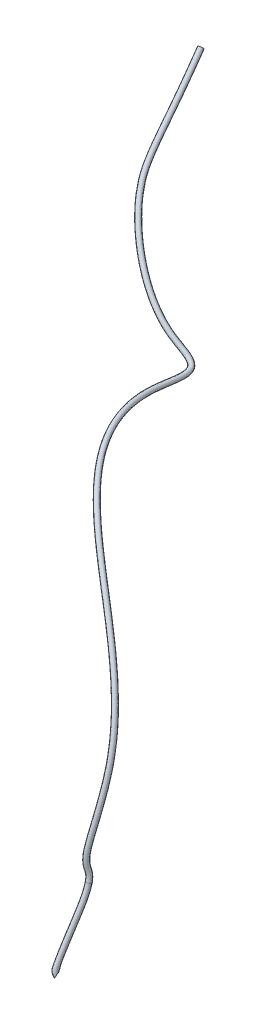
ISO-10303-21;
HEADER;
FILE_DESCRIPTION(('STEP AP214'),'2;1');
FILE_NAME('part.step','',(''),(''),'','','');
FILE_SCHEMA(('AUTOMOTIVE_DESIGN { 1 0 10303 214 1 1 1 1 }'));
ENDSEC;
DATA;
#1=APPLICATION_CONTEXT('core data for automotive mechanical design processes');
#2=APPLICATION_PROTOCOL_DEFINITION('international standard','automotive_design',2000,#1);
#3=PRODUCT_CONTEXT('',#1,'mechanical');
#4=PRODUCT('Part','Part','',(#3));
#5=PRODUCT_RELATED_PRODUCT_CATEGORY('part','',(#4));
#6=PRODUCT_DEFINITION_FORMATION('','',#4);
#7=PRODUCT_DEFINITION_CONTEXT('part definition',#1,'design');
#8=PRODUCT_DEFINITION('design','',#6,#7);
#9=PRODUCT_DEFINITION_SHAPE('','',#8);
#10=(LENGTH_UNIT() NAMED_UNIT(*) SI_UNIT(.MILLI.,.METRE.));
#11=(NAMED_UNIT(*) PLANE_ANGLE_UNIT() SI_UNIT($,.RADIAN.));
#12=(NAMED_UNIT(*) SI_UNIT($,.STERADIAN.) SOLID_ANGLE_UNIT());
#13=UNCERTAINTY_MEASURE_WITH_UNIT(LENGTH_MEASURE(1.E-05),#10,'distance_accuracy_value','');
#14=(GEOMETRIC_REPRESENTATION_CONTEXT(3) GLOBAL_UNCERTAINTY_ASSIGNED_CONTEXT((#13)) GLOBAL_UNIT_ASSIGNED_CONTEXT((#10,
#11,#12)) REPRESENTATION_CONTEXT('',''));
#15=CARTESIAN_POINT('',(0.,0.,0.));
#16=DIRECTION('',(0.,0.,1.));
#17=DIRECTION('',(1.,0.,0.));
#18=AXIS2_PLACEMENT_3D('',#15,#16,#17);
#19=CARTESIAN_POINT('',(-56.1618579724159,36.8513685017414,0.722907331744665));
#20=DIRECTION('',(0.188033840117382,-0.628702409049852,0.754570444574676));
#21=DIRECTION('',(0.,-0.768274502462435,-0.640120526827642));
#22=AXIS2_PLACEMENT_3D('',#19,#20,#21);
#23=PLANE('',#22);
#24=CARTESIAN_POINT('',(-56.1618579724159,36.8513685017414,0.722907331744665));
#25=DIRECTION('',(0.18803384011738,-0.628702409049854,0.754570444574674));
#26=DIRECTION('',(0.,-0.768274502462436,-0.640120526827641));
#27=AXIS2_PLACEMENT_3D('',#24,#25,#26);
#28=CIRCLE('',#27,0.499999999999997);
#29=CARTESIAN_POINT('',(-56.1618579724159,36.4672312505102,0.402847068330846));
#30=VERTEX_POINT('',#29);
#31=EDGE_CURVE('E42',#30,#30,#28,.T.);
#32=ORIENTED_EDGE('',*,*,#31,.F.);
#33=EDGE_LOOP('',(#32));
#34=FACE_BOUND('',#33,.T.);
#35=ADVANCED_FACE('F39',(#34),#23,.F.);
#36=CARTESIAN_POINT('',(-5.56338444811866,-58.2439019103476,80.265397770947));
#37=DIRECTION('',(0.64509938026555,-0.49365881418133,-0.583221882958868));
#38=DIRECTION('',(-0.661697702567297,0.0207715913080831,-0.749482949380238));
#39=AXIS2_PLACEMENT_3D('',#36,#37,#38);
#40=PLANE('',#39);
#41=CARTESIAN_POINT('',(-5.56338444811866,-58.2439019103476,80.265397770947));
#42=DIRECTION('',(-0.645099380265547,0.493658814181321,0.583221882958878));
#43=DIRECTION('',(-0.661697702567292,0.0207715913080886,-0.749482949380236));
#44=AXIS2_PLACEMENT_3D('',#41,#42,#43);
#45=CIRCLE('',#44,0.500000000000001);
#46=CARTESIAN_POINT('',(-5.89423329940231,-58.2335161146935,79.8906562962569));
#47=VERTEX_POINT('',#46);
#48=EDGE_CURVE('E46',#47,#47,#45,.T.);
#49=ORIENTED_EDGE('',*,*,#48,.F.);
#50=EDGE_LOOP('',(#49));
#51=FACE_BOUND('',#50,.T.);
#52=ADVANCED_FACE('F65',(#51),#40,.T.);
#53=CARTESIAN_POINT('',(-56.1618579724159,36.4672312505102,0.402847068330846));
#54=CARTESIAN_POINT('',(-54.7914474302376,31.8851815042636,5.90223638972466));
#55=CARTESIAN_POINT('',(-54.0769841117578,29.2277364698242,9.45924012138075));
#56=CARTESIAN_POINT('',(-52.7395967398252,25.3641684017631,14.6240596383359));
#57=CARTESIAN_POINT('',(-52.1225938893414,24.168941393654,16.2167782039353));
#58=CARTESIAN_POINT('',(-49.6549574701803,20.6416400381113,19.6043497001166));
#59=CARTESIAN_POINT('',(-47.6809142974149,18.1998168235901,21.4137823659855));
#60=CARTESIAN_POINT('',(-43.0120195753384,13.1908008576275,24.0711087130277));
#61=CARTESIAN_POINT('',(-40.3166143803855,10.6234294331354,24.9188311403664));
#62=CARTESIAN_POINT('',(-37.1359956321649,8.17053309754065,24.7718727738652));
#63=CARTESIAN_POINT('',(-36.6730010131799,7.8271232678756,24.723148152974));
#64=CARTESIAN_POINT('',(-35.9960687644546,7.33810403742533,24.6594750809885));
#65=CARTESIAN_POINT('',(-35.7733127357802,7.17941498975671,24.639843866879));
#66=CARTESIAN_POINT('',(-35.3374442830212,6.87235990252674,24.6127719776796));
#67=CARTESIAN_POINT('',(-35.1183957482315,6.73302481073345,24.5986235182426));
#68=CARTESIAN_POINT('',(-34.4765939877156,6.33400789886883,24.5897288655834));
#69=CARTESIAN_POINT('',(-34.0807942996793,6.07522453242336,24.6355133647174));
#70=CARTESIAN_POINT('',(-33.3583188480205,5.60632933329318,24.9317558248052));
#71=CARTESIAN_POINT('',(-33.0273257920909,5.39186475294527,25.2043546772192));
#72=CARTESIAN_POINT('',(-32.6028751045377,5.11334068212192,26.0151203580179));
#73=CARTESIAN_POINT('',(-32.5122275009315,5.04840307386753,26.5018511168328));
#74=CARTESIAN_POINT('',(-32.4297747678937,4.9884660401245,27.5764065327775));
#75=CARTESIAN_POINT('',(-32.4427413035143,4.99448952652503,28.1707421637791));
#76=CARTESIAN_POINT('',(-32.5524351911627,5.06274600456057,30.0690514516348));
#77=CARTESIAN_POINT('',(-32.7183925250711,5.17867026395376,31.4901222061525));
#78=CARTESIAN_POINT('',(-33.0797178565197,5.45626022977237,38.2256958291554));
#79=CARTESIAN_POINT('',(-31.7651142392205,4.8186920943042,42.6343778176923));
#80=CARTESIAN_POINT('',(-28.5004127809766,2.72045016981411,48.2757613228769));
#81=CARTESIAN_POINT('',(-27.1952710873808,1.82911248325002,49.9924958598601));
#82=CARTESIAN_POINT('',(-25.0539614177697,0.224340266835278,52.3767422138549));
#83=CARTESIAN_POINT('',(-24.3155923736799,-0.356741737924014,53.1448050705592));
#84=CARTESIAN_POINT('',(-22.7749419431655,-1.59534794259718,54.6045542391564));
#85=CARTESIAN_POINT('',(-21.9623723480898,-2.25084979746321,55.2851529208007));
#86=CARTESIAN_POINT('',(-17.8986032031439,-5.74329104149429,58.587505095749));
#87=CARTESIAN_POINT('',(-14.509955964611,-9.18708620827157,60.7949487990939));
#88=CARTESIAN_POINT('',(-8.96669406828418,-17.1386830367586,64.8547746365758));
#89=CARTESIAN_POINT('',(-6.81235999020706,-21.644820380773,66.7071024453656));
#90=CARTESIAN_POINT('',(-5.60804932535063,-29.1428928361819,69.6568171818412));
#91=CARTESIAN_POINT('',(-5.56599630631805,-31.838698419157,70.6955708123922));
#92=CARTESIAN_POINT('',(-5.71027528969849,-36.6418549041897,72.4248083592375));
#93=CARTESIAN_POINT('',(-5.89588471995087,-38.7526601095194,73.1155196107829));
#94=CARTESIAN_POINT('',(-5.96272753653105,-41.0911729054943,73.6470606838251));
#95=CARTESIAN_POINT('',(-5.92274942313352,-41.700198168209,73.6888044103424));
#96=CARTESIAN_POINT('',(-5.78308098568486,-42.6420379877892,73.6541218946803));
#97=CARTESIAN_POINT('',(-5.67971369335183,-42.9862137869308,73.5732131901341));
#98=CARTESIAN_POINT('',(-5.46509585770844,-43.8177164652457,73.5042567737617));
#99=CARTESIAN_POINT('',(-5.36162630441347,-44.2914140638824,73.5257948807544));
#100=CARTESIAN_POINT('',(-5.30219540664365,-45.0248879001201,73.7259034567694));
#101=CARTESIAN_POINT('',(-5.29803881204505,-45.08118792378,73.7419321802334));
#102=CARTESIAN_POINT('',(-5.29419260714287,-45.1389811649471,73.7590674318577));
#103=CARTESIAN_POINT('',(-55.1796954222386,36.5875955713075,0.258385463368565));
#104=CARTESIAN_POINT('',(-53.8070141336053,31.9979534484618,5.76688717712141));
#105=CARTESIAN_POINT('',(-53.0895785182748,29.3330404939444,9.33432754754566));
#106=CARTESIAN_POINT('',(-51.7687446457082,25.517306077107,14.4352291374529));
#107=CARTESIAN_POINT('',(-51.190446960829,24.4018881529439,15.9254201759383));
#108=CARTESIAN_POINT('',(-48.8074056974666,20.9955092894471,19.1968594768413));
#109=CARTESIAN_POINT('',(-46.8706279175921,18.5982703502976,20.9757507975935));
#110=CARTESIAN_POINT('',(-42.3096131232676,13.7049929943404,23.5716765277857));
#111=CARTESIAN_POINT('',(-39.6834590123358,11.2089081874913,24.3868934480461));
#112=CARTESIAN_POINT('',(-36.6535926434639,8.87227208052181,24.2469003005385));
#113=CARTESIAN_POINT('',(-36.2033878511975,8.53811484514327,24.1997243925044));
#114=CARTESIAN_POINT('',(-35.5316072235702,8.052797221109,24.1365089015973));
#115=CARTESIAN_POINT('',(-35.3081772337318,7.89359850274431,24.1167655478785));
#116=CARTESIAN_POINT('',(-34.8649994053548,7.5813885790009,24.0892318870669));
#117=CARTESIAN_POINT('',(-34.6308196981251,7.44776182619291,24.0963257026897));
#118=CARTESIAN_POINT('',(-33.9388377350184,7.06175511375604,24.1599239904366));
#119=CARTESIAN_POINT('',(-33.5115666176303,6.78788472839916,24.2200781041109));
#120=CARTESIAN_POINT('',(-32.686977639319,6.26397590350905,24.5834842085072));
#121=CARTESIAN_POINT('',(-32.2836323460844,6.00546123594636,24.9232522017323));
#122=CARTESIAN_POINT('',(-31.7826276494551,5.68053548908773,25.8964469119701));
#123=CARTESIAN_POINT('',(-31.6868512231807,5.61015501941092,26.4361835117128));
#124=CARTESIAN_POINT('',(-31.5992780649124,5.54649611811373,27.5774762164564));
#125=CARTESIAN_POINT('',(-31.6136315335895,5.55338346919349,28.1884982350152));
#126=CARTESIAN_POINT('',(-31.7250640751795,5.62272418402666,30.1168467123851));
#127=CARTESIAN_POINT('',(-31.8949095241133,5.74513532513391,31.5325581844823));
#128=CARTESIAN_POINT('',(-32.2172094464358,5.96827960484714,38.1419085001674));
#129=CARTESIAN_POINT('',(-30.9060251261673,5.30165375853994,42.4179879978003));
#130=CARTESIAN_POINT('',(-27.6735511186962,3.12283022348759,47.8771164424639));
#131=CARTESIAN_POINT('',(-26.3815994669215,2.19630373794042,49.5328454442588));
#132=CARTESIAN_POINT('',(-24.2746548953482,0.507873803473249,51.8160886358244));
#133=CARTESIAN_POINT('',(-23.5537057205237,-0.119642271334898,52.5408269486993));
#134=CARTESIAN_POINT('',(-22.044506913606,-1.40432763316623,53.9477034857612));
#135=CARTESIAN_POINT('',(-21.2350528260062,-2.0349770957906,54.6336401671705));
#136=CARTESIAN_POINT('',(-17.1970120802178,-5.50525857787962,57.915100677578));
#137=CARTESIAN_POINT('',(-13.7967107269144,-8.95378554630872,60.1315837385698));
#138=CARTESIAN_POINT('',(-8.19373591693222,-16.9909659399962,64.2351646568452));
#139=CARTESIAN_POINT('',(-5.98858832604636,-21.5835297454862,66.1250565320266));
#140=CARTESIAN_POINT('',(-4.75156544578324,-29.2852693897491,69.1548932064691));
#141=CARTESIAN_POINT('',(-4.71159648261342,-32.0198900232476,70.2082085883938));
#142=CARTESIAN_POINT('',(-4.85694729306352,-36.8583137546627,71.9501207884626));
#143=CARTESIAN_POINT('',(-5.04176131125195,-38.9859714113649,72.6404259603126));
#144=CARTESIAN_POINT('',(-5.10398763872935,-41.1629720296834,73.135255377057));
#145=CARTESIAN_POINT('',(-5.06652218605153,-41.6632250666509,73.1622972374126));
#146=CARTESIAN_POINT('',(-4.95861896576305,-42.3912014844826,73.1354260955804));
#147=CARTESIAN_POINT('',(-4.87606686842961,-42.6683531397744,73.0658128041365));
#148=CARTESIAN_POINT('',(-4.62871167331727,-43.6270117507486,72.9861526198295));
#149=CARTESIAN_POINT('',(-4.49459704661867,-44.256896438704,73.0190507423341));
#150=CARTESIAN_POINT('',(-4.42686513373844,-45.0928754181428,73.2471151250771));
#151=CARTESIAN_POINT('',(-4.42215516054631,-45.1565701114585,73.2652330574555));
#152=CARTESIAN_POINT('',(-4.4178176549228,-45.2214920335965,73.2844494258347));
#153=CARTESIAN_POINT('',(-55.1796954222386,37.3558700737699,0.898505990196202));
#154=CARTESIAN_POINT('',(-53.8110548982907,32.7797384892106,6.39079231697204));
#155=CARTESIAN_POINT('',(-53.0990743550198,30.1331588113834,9.93409535877855));
#156=CARTESIAN_POINT('',(-51.7778662977967,26.3162971329319,15.0365036241633));
#157=CARTESIAN_POINT('',(-51.1818969674141,25.1596266530138,16.5825330787923));
#158=CARTESIAN_POINT('',(-48.7255977777581,21.6485309626339,19.9545409787805));
#159=CARTESIAN_POINT('',(-46.7582960290998,19.2151615716054,21.7575698199323));
#160=CARTESIAN_POINT('',(-42.1128165203392,14.2312667127782,24.4015688618405));
#161=CARTESIAN_POINT('',(-39.4338289367386,11.6810521868391,25.2410640678269));
#162=CARTESIAN_POINT('',(-36.291413144374,9.25761809980045,25.0958705343605));
#163=CARTESIAN_POINT('',(-35.8359644347556,8.91988038375154,25.0478676277442));
#164=CARTESIAN_POINT('',(-35.1757884176708,8.44297788707933,24.9857291234707));
#165=CARTESIAN_POINT('',(-34.9595488201742,8.28894562737085,24.9666826611565));
#166=CARTESIAN_POINT('',(-34.5394725336319,7.99301900152156,24.9405795649747));
#167=CARTESIAN_POINT('',(-34.3330761809304,7.85244718473833,24.961822593567));
#168=CARTESIAN_POINT('',(-33.750485559271,7.45442930080345,25.0634480281488));
#169=CARTESIAN_POINT('',(-33.4076442594313,7.22049662017161,25.1290995448526));
#170=CARTESIAN_POINT('',(-32.843435020115,6.8407549230532,25.4002582537813));
#171=CARTESIAN_POINT('',(-32.6249939438288,6.69535190321284,25.5984683238816));
#172=CARTESIAN_POINT('',(-32.3256642831813,6.4935765296686,26.2005346495695));
#173=CARTESIAN_POINT('',(-32.2361895555985,6.43231064039712,26.6064644887508));
#174=CARTESIAN_POINT('',(-32.1611299683899,6.37774733915234,27.5846834767649));
#175=CARTESIAN_POINT('',(-32.1721520273984,6.38256991584104,28.1534166503217));
#176=CARTESIAN_POINT('',(-32.2789283848452,6.44900807823907,30.0011170744805));
#177=CARTESIAN_POINT('',(-32.4559157928427,6.56686277052491,31.4210985260546));
#178=CARTESIAN_POINT('',(-32.7412893101908,6.83303257434517,38.2694810273415));
#179=CARTESIAN_POINT('',(-31.3203953888865,6.16341396052205,42.770866248535));
#180=CARTESIAN_POINT('',(-27.841538812793,3.96880126757664,48.3927008024976));
#181=CARTESIAN_POINT('',(-26.4567070132958,3.03834591306291,50.0770298681235));
#182=CARTESIAN_POINT('',(-24.1939061396097,1.34840397084038,52.3543189674949));
#183=CARTESIAN_POINT('',(-23.4062481134022,0.724174745391436,53.0586835894842));
#184=CARTESIAN_POINT('',(-21.8107332119835,-0.570999256179648,54.4505554309992));
#185=CARTESIAN_POINT('',(-21.0022482952052,-1.21946889851819,55.1640363671588));
#186=CARTESIAN_POINT('',(-16.8870556386689,-4.75609591981361,58.5082528417758));
#187=CARTESIAN_POINT('',(-13.432008236952,-8.26076243757015,60.7598238536492));
#188=CARTESIAN_POINT('',(-7.73486970168507,-16.4330928641887,64.9324407896058));
#189=CARTESIAN_POINT('',(-5.48974326583235,-21.1079957942392,66.8563893802704));
#190=CARTESIAN_POINT('',(-4.23041421936934,-28.9486142545673,69.9408604805287));
#191=CARTESIAN_POINT('',(-4.19100179685776,-31.7151930087371,71.006395576619));
#192=CARTESIAN_POINT('',(-4.33808364796236,-36.6119501425335,72.7692954061189));
#193=CARTESIAN_POINT('',(-4.52551732552976,-38.7590744918464,73.4679138295837));
#194=CARTESIAN_POINT('',(-4.59019414257081,-41.0218111356678,73.9822308502089));
#195=CARTESIAN_POINT('',(-4.55068603458149,-41.5769373060956,74.0156010587703));
#196=CARTESIAN_POINT('',(-4.43076692074015,-42.3854510683077,73.9857196217568));
#197=CARTESIAN_POINT('',(-4.34559546224793,-42.6655441387415,73.9157324233656));
#198=CARTESIAN_POINT('',(-4.12870073079677,-43.5056203408155,73.8458178586665));
#199=CARTESIAN_POINT('',(-4.01210386376584,-44.0412393360441,73.8696636109253));
#200=CARTESIAN_POINT('',(-3.94886010242871,-44.8217183346863,74.0825812755159));
#201=CARTESIAN_POINT('',(-3.94444838464255,-44.8814433986593,74.0995795864544));
#202=CARTESIAN_POINT('',(-3.94037488765983,-44.942570362486,74.1176920357674));
#203=CARTESIAN_POINT('',(-56.1618579724159,37.2355057529726,1.04296759515848));
#204=CARTESIAN_POINT('',(-54.7954881948725,32.6669665450503,6.52614152957381));
#205=CARTESIAN_POINT('',(-54.0864799484971,30.0278547872632,10.0590079326136));
#206=CARTESIAN_POINT('',(-52.7487183919194,26.1631594575881,15.2253341250463));
#207=CARTESIAN_POINT('',(-52.1140438959265,24.9266798937193,16.8738911067846));
#208=CARTESIAN_POINT('',(-49.5731495504718,21.2946617113032,20.3620312020608));
#209=CARTESIAN_POINT('',(-47.5685824089225,18.8167080448947,22.1956013883243));
#210=CARTESIAN_POINT('',(-42.8152229724101,13.7170745760685,24.9010010470825));
#211=CARTESIAN_POINT('',(-40.0669843048005,11.0955734324832,25.7730017601351));
#212=CARTESIAN_POINT('',(-36.773816133073,8.55587911681929,25.6208430076892));
#213=CARTESIAN_POINT('',(-36.3055775967371,8.20888880648424,25.5712913882137));
#214=CARTESIAN_POINT('',(-35.6402499585557,7.72828470339548,25.5086953028619));
#215=CARTESIAN_POINT('',(-35.4246843222235,7.57476211438315,25.4897609801571));
#216=CARTESIAN_POINT('',(-35.0119174112974,7.28399032504752,25.4641196555874));
#217=CARTESIAN_POINT('',(-34.8206522310373,7.13771016927893,25.4641204091198));
#218=CARTESIAN_POINT('',(-34.2882418119673,6.72668208591614,25.4932529032956));
#219=CARTESIAN_POINT('',(-33.976871941481,6.50783642419582,25.5445348054591));
#220=CARTESIAN_POINT('',(-33.5147762288158,6.18310835283734,25.7485298700792));
#221=CARTESIAN_POINT('',(-33.3686873898353,6.08175542021136,25.8795707993687));
#222=CARTESIAN_POINT('',(-33.1459117382639,5.92638172270319,26.319208095617));
#223=CARTESIAN_POINT('',(-33.0615658333493,5.87055869485374,26.6721320938721));
#224=CARTESIAN_POINT('',(-32.9916266713711,5.81971726116311,27.5836137930847));
#225=CARTESIAN_POINT('',(-33.0012617973232,5.82367597317312,28.1356605790866));
#226=CARTESIAN_POINT('',(-33.1062995008284,5.8890298987719,29.9533218137281));
#227=CARTESIAN_POINT('',(-33.2793987938076,6.00039770934447,31.3786625477224));
#228=CARTESIAN_POINT('',(-33.6037977202461,6.3210131992716,38.353268356339));
#229=CARTESIAN_POINT('',(-32.1794845019559,5.68045229628632,42.9872560684109));
#230=CARTESIAN_POINT('',(-28.6684004750653,3.56642121390317,48.7913456829186));
#231=CARTESIAN_POINT('',(-27.2703786337467,2.67115465837252,50.5366802837289));
#232=CARTESIAN_POINT('',(-24.9732126620354,1.06487043420242,52.9149725455234));
#233=CARTESIAN_POINT('',(-24.1681347665584,0.487075278802326,53.6626617113441));
#234=CARTESIAN_POINT('',(-22.541168241543,-0.76201956561059,55.1074061843943));
#235=CARTESIAN_POINT('',(-21.7295678172888,-1.43534160018858,55.815549120789));
#236=CARTESIAN_POINT('',(-17.588646761595,-4.99412838343709,59.1806572599468));
#237=CARTESIAN_POINT('',(-14.1452534746486,-8.4940630995422,61.4231889141824));
#238=CARTESIAN_POINT('',(-8.50782785303703,-16.580809960942,65.5520507693272));
#239=CARTESIAN_POINT('',(-6.31351492999304,-21.1692864295167,67.4384352936469));
#240=CARTESIAN_POINT('',(-5.08689809893672,-28.8062377010049,70.4427844558812));
#241=CARTESIAN_POINT('',(-5.04540162055793,-31.534001404651,71.4937578006353));
#242=CARTESIAN_POINT('',(-5.19141164460178,-36.395491292056,73.243982976876));
#243=CARTESIAN_POINT('',(-5.37964073422868,-38.5257631899983,73.943007480059));
#244=CARTESIAN_POINT('',(-5.44893404037252,-40.9500120114804,74.4940361569736));
#245=CARTESIAN_POINT('',(-5.40691327166262,-41.6139104076545,74.5421082317019));
#246=CARTESIAN_POINT('',(-5.25522894066283,-42.6362875716135,74.504415420855));
#247=CARTESIAN_POINT('',(-5.14924228717016,-42.9834047858966,74.4231328093604));
#248=CARTESIAN_POINT('',(-4.96508491518795,-43.696325055314,74.3639220126015));
#249=CARTESIAN_POINT('',(-4.87913312156418,-44.0757569612201,74.376407749348));
#250=CARTESIAN_POINT('',(-4.82419037533365,-44.7537308166637,74.561369607208));
#251=CARTESIAN_POINT('',(-4.82033203614076,-44.8060612109812,74.576278709232));
#252=CARTESIAN_POINT('',(-4.81674983987916,-44.8600594938371,74.5923100417898));
#253=CARTESIAN_POINT('',(-57.1440205225931,37.1151414321752,1.18742920012077));
#254=CARTESIAN_POINT('',(-55.7799214914544,32.55419460089,6.66149074217559));
#255=CARTESIAN_POINT('',(-55.0738855419744,29.9225507631431,10.1839205064487));
#256=CARTESIAN_POINT('',(-53.7195704860421,26.0100217822443,15.4141646259293));
#257=CARTESIAN_POINT('',(-53.046190824439,24.6937331344247,17.165249134777));
#258=CARTESIAN_POINT('',(-50.4207013231855,20.9407924599724,20.7695214253411));
#259=CARTESIAN_POINT('',(-48.3788687887452,18.418254518184,22.6336329567164));
#260=CARTESIAN_POINT('',(-43.5176294244809,13.2028824393588,25.4004332323245));
#261=CARTESIAN_POINT('',(-40.7001396728624,10.5100946781273,26.3049394524433));
#262=CARTESIAN_POINT('',(-37.2562191217721,7.85414013383814,26.145815481018));
#263=CARTESIAN_POINT('',(-36.7751907587186,7.49789722921693,26.0947151486832));
#264=CARTESIAN_POINT('',(-36.1047114994406,7.01359151971163,26.0316614822532));
#265=CARTESIAN_POINT('',(-35.8898198242728,6.86057860139545,26.0128392991576));
#266=CARTESIAN_POINT('',(-35.4843622889629,6.57496164857348,25.9876597462001));
#267=CARTESIAN_POINT('',(-35.3082282811441,6.42297315381953,25.9664182246727));
#268=CARTESIAN_POINT('',(-34.8259980646636,5.99893487102884,25.9230577784424));
#269=CARTESIAN_POINT('',(-34.5460996235307,5.79517622822002,25.9599700660656));
#270=CARTESIAN_POINT('',(-34.1861174375166,5.52546178262146,26.0968014863771));
#271=CARTESIAN_POINT('',(-34.1123808358419,5.46815893720988,26.1606732748559));
#272=CARTESIAN_POINT('',(-33.9661591933464,5.35918691573778,26.4378815416645));
#273=CARTESIAN_POINT('',(-33.8869421111001,5.30880674931034,26.7377996989934));
#274=CARTESIAN_POINT('',(-33.8221233743524,5.26168718317387,27.5825441094045));
#275=CARTESIAN_POINT('',(-33.8303715672481,5.2647820305052,28.1179045078515));
#276=CARTESIAN_POINT('',(-33.9336706168116,5.32905171930474,29.9055265529757));
#277=CARTESIAN_POINT('',(-34.1028817947726,5.43393264816403,31.3362265693903));
#278=CARTESIAN_POINT('',(-34.4663061303013,5.80899382419803,38.4370556853365));
#279=CARTESIAN_POINT('',(-33.0385736150253,5.19749063205059,43.2036458882867));
#280=CARTESIAN_POINT('',(-29.4952621373376,3.16404116022969,49.1899905633396));
#281=CARTESIAN_POINT('',(-28.0840502541977,2.30396340368213,50.9963306993344));
#282=CARTESIAN_POINT('',(-25.7525191844611,0.781336897564457,53.4756261235519));
#283=CARTESIAN_POINT('',(-24.9300214197146,0.249975812213217,54.266639833204));
#284=CARTESIAN_POINT('',(-23.2716032711025,-0.953039875041532,55.7642569377894));
#285=CARTESIAN_POINT('',(-22.4568873393723,-1.65121430185898,56.4670618744193));
#286=CARTESIAN_POINT('',(-18.2902378845212,-5.23216084706058,59.8530616781178));
#287=CARTESIAN_POINT('',(-14.8584987123453,-8.72736376151425,62.0865539747156));
#288=CARTESIAN_POINT('',(-9.280786004389,-16.7285270576952,66.1716607490486));
#289=CARTESIAN_POINT('',(-7.13728659415375,-21.2305770647942,68.0204812070234));
#290=CARTESIAN_POINT('',(-5.94338197850411,-28.6638611474425,70.9447084312337));
#291=CARTESIAN_POINT('',(-5.89980144425813,-31.3528098005648,71.9811200246515));
#292=CARTESIAN_POINT('',(-6.04473964124123,-36.1790324415785,73.7186705476331));
#293=CARTESIAN_POINT('',(-6.23376414292759,-38.2924518881503,74.4181011305343));
#294=CARTESIAN_POINT('',(-6.30767393817422,-40.878212887293,75.0058414637383));
#295=CARTESIAN_POINT('',(-6.26314050874374,-41.6508835092134,75.0686154046334));
#296=CARTESIAN_POINT('',(-6.07969096058551,-42.8871240749192,75.0231112199531));
#297=CARTESIAN_POINT('',(-5.95288911209237,-43.3012654330516,74.9305331953553));
#298=CARTESIAN_POINT('',(-5.80146909957912,-43.8870297698126,74.8820261665365));
#299=CARTESIAN_POINT('',(-5.74616237936253,-44.1102745863961,74.8831518877706));
#300=CARTESIAN_POINT('',(-5.69952064823859,-44.6857432986412,75.0401579389001));
#301=CARTESIAN_POINT('',(-5.69621568763899,-44.7306790233031,75.0529778320096));
#302=CARTESIAN_POINT('',(-5.6931247920985,-44.7775486251883,75.0669280478123));
#303=CARTESIAN_POINT('',(-57.1440205225931,36.3468669297128,0.547308673293128));
#304=CARTESIAN_POINT('',(-55.7758807268699,31.7724095600654,6.03758560232792));
#305=CARTESIAN_POINT('',(-55.0643897052408,29.1224324457041,9.58415269521584));
#306=CARTESIAN_POINT('',(-53.7104488339422,25.2110307264193,14.812890139219));
#307=CARTESIAN_POINT('',(-53.0547408178539,23.935994634364,16.5081362319322));
#308=CARTESIAN_POINT('',(-50.5025092428941,20.2877707867755,20.0118399233919));
#309=CARTESIAN_POINT('',(-48.4912006772376,17.8013632968826,21.8518139343776));
#310=CARTESIAN_POINT('',(-43.7144260274092,12.6766087209145,24.5705408982696));
#311=CARTESIAN_POINT('',(-40.9497697484352,10.0379506787795,25.4507688326868));
#312=CARTESIAN_POINT('',(-37.618398620866,7.46879411455949,25.2968452471919));
#313=CARTESIAN_POINT('',(-37.1426141751624,7.11613169060793,25.2465719134435));
#314=CARTESIAN_POINT('',(-36.460530305339,6.62341085374165,25.1824412603798));
#315=CARTESIAN_POINT('',(-36.2384482378286,6.46523147676912,25.1629221858795));
#316=CARTESIAN_POINT('',(-35.8098891606876,6.16333122605258,25.1363120682923));
#317=CARTESIAN_POINT('',(-35.605971798338,6.01828779527399,25.1009213337955));
#318=CARTESIAN_POINT('',(-35.0143502404127,5.60626068398162,25.0195337407302));
#319=CARTESIAN_POINT('',(-34.6500219817284,5.36256433644755,25.050948625324));
#320=CARTESIAN_POINT('',(-34.029660056722,4.9486827630773,25.2800274411031));
#321=CARTESIAN_POINT('',(-33.7710192380975,4.77826826994419,25.485457152706));
#322=CARTESIAN_POINT('',(-33.4231225596202,4.5461458751561,26.1337938040657));
#323=CARTESIAN_POINT('',(-33.3376037786823,4.48665112832413,26.5675187219528));
#324=CARTESIAN_POINT('',(-33.260271470875,4.43043596213526,27.5753368490986));
#325=CARTESIAN_POINT('',(-33.2718510734392,4.43559558385656,28.1529860925429));
#326=CARTESIAN_POINT('',(-33.3798063071459,4.50276782509447,30.0212561908845));
#327=CARTESIAN_POINT('',(-33.5418755260289,4.61220520277361,31.4476862278226));
#328=CARTESIAN_POINT('',(-33.9422262666036,4.9442408546976,38.3094831581434));
#329=CARTESIAN_POINT('',(-32.6242033522737,4.33573043006846,42.8507676375842));
#330=CARTESIAN_POINT('',(-29.3272744432569,2.31807011614062,48.6744062032898));
#331=CARTESIAN_POINT('',(-28.0089427078402,1.46192122855963,50.4521462754613));
#332=CARTESIAN_POINT('',(-25.8332679401912,-0.0591932698026853,52.9373957918855));
#333=CARTESIAN_POINT('',(-25.0774790268362,-0.593841204513124,53.7487831924191));
#334=CARTESIAN_POINT('',(-23.5053769727251,-1.78636825202812,55.2614049925515));
#335=CARTESIAN_POINT('',(-22.6896918701734,-2.46672249913582,55.936665674431));
#336=CARTESIAN_POINT('',(-18.6001943260701,-5.98132350510897,59.25990951392));
#337=CARTESIAN_POINT('',(-15.2232012023077,-9.42038687023445,61.4583138596179));
#338=CARTESIAN_POINT('',(-9.73965221963615,-17.2864001335211,65.4743846163064));
#339=CARTESIAN_POINT('',(-7.63613165436777,-21.7061110160598,67.2891483587046));
#340=CARTESIAN_POINT('',(-6.46453320491802,-29.0005162826146,70.1587411572133));
#341=CARTESIAN_POINT('',(-6.4203961300227,-31.6575068150664,71.1829330363906));
#342=CARTESIAN_POINT('',(-6.56360328633348,-36.4253960537167,72.8994959300124));
#343=CARTESIAN_POINT('',(-6.75000812864979,-38.5193488076738,73.5906132612531));
#344=CARTESIAN_POINT('',(-6.82146743433276,-41.0193737813052,74.1588659905933));
#345=CARTESIAN_POINT('',(-6.77897666021551,-41.737171269767,74.2153115832721));
#346=CARTESIAN_POINT('',(-6.60754300560669,-42.8928744910958,74.1728176937802));
#347=CARTESIAN_POINT('',(-6.48336051827405,-43.3040744340872,74.0806135761317));
#348=CARTESIAN_POINT('',(-6.30148004209962,-44.0084211797429,74.0223609276939));
#349=CARTESIAN_POINT('',(-6.22865556220829,-44.3259316890608,74.0325390191746));
#350=CARTESIAN_POINT('',(-6.17752567954889,-44.9569003820973,74.2046917884617));
#351=CARTESIAN_POINT('',(-6.17392246354382,-45.0058057361015,74.2186313030114));
#352=CARTESIAN_POINT('',(-6.17056755936296,-45.0564702962976,74.2336854378807));
#353=CARTESIAN_POINT('',(-56.1618579724159,36.4672312505102,0.402847068330846));
#354=CARTESIAN_POINT('',(-54.7914474302376,31.8851815042636,5.90223638972466));
#355=CARTESIAN_POINT('',(-54.0769841117578,29.2277364698242,9.45924012138075));
#356=CARTESIAN_POINT('',(-52.7395967398252,25.3641684017631,14.6240596383359));
#357=CARTESIAN_POINT('',(-52.1225938893414,24.168941393654,16.2167782039353));
#358=CARTESIAN_POINT('',(-49.6549574701803,20.6416400381113,19.6043497001166));
#359=CARTESIAN_POINT('',(-47.6809142974149,18.1998168235901,21.4137823659855));
#360=CARTESIAN_POINT('',(-43.0120195753384,13.1908008576275,24.0711087130277));
#361=CARTESIAN_POINT('',(-40.3166143803855,10.6234294331354,24.9188311403664));
#362=CARTESIAN_POINT('',(-37.1359956321649,8.17053309754065,24.7718727738652));
#363=CARTESIAN_POINT('',(-36.6730010131799,7.8271232678756,24.723148152974));
#364=CARTESIAN_POINT('',(-35.9960687644546,7.33810403742533,24.6594750809885));
#365=CARTESIAN_POINT('',(-35.7733127357802,7.17941498975671,24.639843866879));
#366=CARTESIAN_POINT('',(-35.3374442830212,6.87235990252674,24.6127719776796));
#367=CARTESIAN_POINT('',(-35.1183957482315,6.73302481073345,24.5986235182426));
#368=CARTESIAN_POINT('',(-34.4765939877156,6.33400789886883,24.5897288655834));
#369=CARTESIAN_POINT('',(-34.0807942996793,6.07522453242336,24.6355133647174));
#370=CARTESIAN_POINT('',(-33.3583188480205,5.60632933329318,24.9317558248052));
#371=CARTESIAN_POINT('',(-33.0273257920909,5.39186475294527,25.2043546772192));
#372=CARTESIAN_POINT('',(-32.6028751045377,5.11334068212192,26.0151203580179));
#373=CARTESIAN_POINT('',(-32.5122275009315,5.04840307386753,26.5018511168328));
#374=CARTESIAN_POINT('',(-32.4297747678937,4.9884660401245,27.5764065327775));
#375=CARTESIAN_POINT('',(-32.4427413035143,4.99448952652503,28.1707421637791));
#376=CARTESIAN_POINT('',(-32.5524351911627,5.06274600456057,30.0690514516348));
#377=CARTESIAN_POINT('',(-32.7183925250711,5.17867026395376,31.4901222061525));
#378=CARTESIAN_POINT('',(-33.0797178565197,5.45626022977237,38.2256958291554));
#379=CARTESIAN_POINT('',(-31.7651142392205,4.8186920943042,42.6343778176923));
#380=CARTESIAN_POINT('',(-28.5004127809766,2.72045016981411,48.2757613228769));
#381=CARTESIAN_POINT('',(-27.1952710873808,1.82911248325002,49.9924958598601));
#382=CARTESIAN_POINT('',(-25.0539614177697,0.224340266835278,52.3767422138549));
#383=CARTESIAN_POINT('',(-24.3155923736799,-0.356741737924014,53.1448050705592));
#384=CARTESIAN_POINT('',(-22.7749419431655,-1.59534794259718,54.6045542391564));
#385=CARTESIAN_POINT('',(-21.9623723480898,-2.25084979746321,55.2851529208007));
#386=CARTESIAN_POINT('',(-17.8986032031439,-5.74329104149429,58.587505095749));
#387=CARTESIAN_POINT('',(-14.509955964611,-9.18708620827157,60.7949487990939));
#388=CARTESIAN_POINT('',(-8.96669406828418,-17.1386830367586,64.8547746365758));
#389=CARTESIAN_POINT('',(-6.81235999020706,-21.644820380773,66.7071024453656));
#390=CARTESIAN_POINT('',(-5.60804932535063,-29.1428928361819,69.6568171818412));
#391=CARTESIAN_POINT('',(-5.56599630631805,-31.838698419157,70.6955708123922));
#392=CARTESIAN_POINT('',(-5.71027528969849,-36.6418549041897,72.4248083592375));
#393=CARTESIAN_POINT('',(-5.89588471995087,-38.7526601095194,73.1155196107829));
#394=CARTESIAN_POINT('',(-5.96272753653105,-41.0911729054943,73.6470606838251));
#395=CARTESIAN_POINT('',(-5.92274942313352,-41.700198168209,73.6888044103424));
#396=CARTESIAN_POINT('',(-5.78308098568486,-42.6420379877892,73.6541218946803));
#397=CARTESIAN_POINT('',(-5.67971369335183,-42.9862137869308,73.5732131901341));
#398=CARTESIAN_POINT('',(-5.46509585770844,-43.8177164652457,73.5042567737617));
#399=CARTESIAN_POINT('',(-5.36162630441347,-44.2914140638824,73.5257948807544));
#400=CARTESIAN_POINT('',(-5.30219540664365,-45.0248879001201,73.7259034567694));
#401=CARTESIAN_POINT('',(-5.29803881204505,-45.08118792378,73.7419321802334));
#402=CARTESIAN_POINT('',(-5.29419260714287,-45.1389811649471,73.7590674318577));
#403=(BOUNDED_SURFACE() B_SPLINE_SURFACE(3,3,((#53,#54,#55,#56,#57,#58,#59,#60,#61,#62,#63,#64,
#65,#66,#67,#68,#69,#70,#71,#72,#73,#74,#75,#76,#77,#78,#79,#80,#81,#82,#83,#84,#85,#86,#87,#88,
#89,#90,#91,#92,#93,#94,#95,#96,#97,#98,#99,#100,#101,#102),(#103,#104,#105,#106,#107,#108,#109,
#110,#111,#112,#113,#114,#115,#116,#117,#118,#119,#120,#121,#122,#123,#124,#125,#126,#127,#128,
#129,#130,#131,#132,#133,#134,#135,#136,#137,#138,#139,#140,#141,#142,#143,#144,#145,#146,#147,
#148,#149,#150,#151,#152),(#153,#154,#155,#156,#157,#158,#159,#160,#161,#162,#163,#164,#165,
#166,#167,#168,#169,#170,#171,#172,#173,#174,#175,#176,#177,#178,#179,#180,#181,#182,#183,#184,
#185,#186,#187,#188,#189,#190,#191,#192,#193,#194,#195,#196,#197,#198,#199,#200,#201,#202),
(#203,#204,#205,#206,#207,#208,#209,#210,#211,#212,#213,#214,#215,#216,#217,#218,#219,#220,#221,
#222,#223,#224,#225,#226,#227,#228,#229,#230,#231,#232,#233,#234,#235,#236,#237,#238,#239,#240,
#241,#242,#243,#244,#245,#246,#247,#248,#249,#250,#251,#252),(#253,#254,#255,#256,#257,#258,
#259,#260,#261,#262,#263,#264,#265,#266,#267,#268,#269,#270,#271,#272,#273,#274,#275,#276,#277,
#278,#279,#280,#281,#282,#283,#284,#285,#286,#287,#288,#289,#290,#291,#292,#293,#294,#295,#296,
#297,#298,#299,#300,#301,#302),(#303,#304,#305,#306,#307,#308,#309,#310,#311,#312,#313,#314,
#315,#316,#317,#318,#319,#320,#321,#322,#323,#324,#325,#326,#327,#328,#329,#330,#331,#332,#333,
#334,#335,#336,#337,#338,#339,#340,#341,#342,#343,#344,#345,#346,#347,#348,#349,#350,#351,#352),
(#353,#354,#355,#356,#357,#358,#359,#360,#361,#362,#363,#364,#365,#366,#367,#368,#369,#370,#371,
#372,#373,#374,#375,#376,#377,#378,#379,#380,#381,#382,#383,#384,#385,#386,#387,#388,#389,#390,
#391,#392,#393,#394,#395,#396,#397,#398,#399,#400,#401,#402)),.UNSPECIFIED.,.T.,.F.,
.F.) B_SPLINE_SURFACE_WITH_KNOTS((4,3,4),(4,2,2,2,2,2,2,2,2,2,2,2,2,2,2,2,2,2,2,2,2,2,2,2,4),
(0.,0.5,1.),(0.,0.0600932919380901,0.12018658387618,0.185858009014682,0.251529434153184,
0.262523778696313,0.268020950967877,0.273518123239442,0.284512467782571,0.2955068123257,
0.30650115686883,0.317495501411959,0.339484190498217,0.428053489861483,0.472338139543116,
0.494480464383933,0.516622789224749,0.605192088588015,0.693761387951282,0.74001378387996,
0.786266179808638,0.817929104136031,0.849592028463424,0.881254952790816,0.883817176395277),
.UNSPECIFIED.) GEOMETRIC_REPRESENTATION_ITEM() RATIONAL_B_SPLINE_SURFACE(((1.,1.,1.,1.,1.,1.,1.,
1.,1.,1.,1.,1.,1.,1.,1.,1.,1.,1.,1.,1.,1.,1.,1.,1.,1.,1.,1.,1.,1.,1.,1.,1.,1.,1.,1.,1.,1.,1.,1.,
1.,1.,1.,1.,1.,1.,1.,1.,1.,1.,1.),(0.333333333333333,0.333333333333333,0.333333333333333,
0.333333333333333,0.333333333333333,0.333333333333333,0.333333333333333,0.333333333333333,
0.333333333333333,0.333333333333333,0.333333333333333,0.333333333333333,0.333333333333333,
0.333333333333333,0.333333333333333,0.333333333333333,0.333333333333333,0.333333333333333,
0.333333333333333,0.333333333333333,0.333333333333333,0.333333333333333,0.333333333333333,
0.333333333333333,0.333333333333333,0.333333333333333,0.333333333333333,0.333333333333333,
0.333333333333333,0.333333333333333,0.333333333333333,0.333333333333333,0.333333333333333,
0.333333333333333,0.333333333333333,0.333333333333333,0.333333333333333,0.333333333333333,
0.333333333333333,0.333333333333333,0.333333333333333,0.333333333333333,0.333333333333333,
0.333333333333333,0.333333333333333,0.333333333333333,0.333333333333333,0.333333333333333,
0.333333333333333,0.333333333333333),(0.333333333333333,0.333333333333333,0.333333333333333,
0.333333333333333,0.333333333333333,0.333333333333333,0.333333333333333,0.333333333333333,
0.333333333333333,0.333333333333333,0.333333333333333,0.333333333333333,0.333333333333333,
0.333333333333333,0.333333333333333,0.333333333333333,0.333333333333333,0.333333333333333,
0.333333333333333,0.333333333333333,0.333333333333333,0.333333333333333,0.333333333333333,
0.333333333333333,0.333333333333333,0.333333333333333,0.333333333333333,0.333333333333333,
0.333333333333333,0.333333333333333,0.333333333333333,0.333333333333333,0.333333333333333,
0.333333333333333,0.333333333333333,0.333333333333333,0.333333333333333,0.333333333333333,
0.333333333333333,0.333333333333333,0.333333333333333,0.333333333333333,0.333333333333333,
0.333333333333333,0.333333333333333,0.333333333333333,0.333333333333333,0.333333333333333,
0.333333333333333,0.333333333333333),(1.,1.,1.,1.,1.,1.,1.,1.,1.,1.,1.,1.,1.,1.,1.,1.,1.,1.,1.,
1.,1.,1.,1.,1.,1.,1.,1.,1.,1.,1.,1.,1.,1.,1.,1.,1.,1.,1.,1.,1.,1.,1.,1.,1.,1.,1.,1.,1.,1.,1.),
(0.333333333333333,0.333333333333333,0.333333333333333,0.333333333333333,0.333333333333333,
0.333333333333333,0.333333333333333,0.333333333333333,0.333333333333333,0.333333333333333,
0.333333333333333,0.333333333333333,0.333333333333333,0.333333333333333,0.333333333333333,
0.333333333333333,0.333333333333333,0.333333333333333,0.333333333333333,0.333333333333333,
0.333333333333333,0.333333333333333,0.333333333333333,0.333333333333333,0.333333333333333,
0.333333333333333,0.333333333333333,0.333333333333333,0.333333333333333,0.333333333333333,
0.333333333333333,0.333333333333333,0.333333333333333,0.333333333333333,0.333333333333333,
0.333333333333333,0.333333333333333,0.333333333333333,0.333333333333333,0.333333333333333,
0.333333333333333,0.333333333333333,0.333333333333333,0.333333333333333,0.333333333333333,
0.333333333333333,0.333333333333333,0.333333333333333,0.333333333333333,0.333333333333333),
(0.333333333333333,0.333333333333333,0.333333333333333,0.333333333333333,0.333333333333333,
0.333333333333333,0.333333333333333,0.333333333333333,0.333333333333333,0.333333333333333,
0.333333333333333,0.333333333333333,0.333333333333333,0.333333333333333,0.333333333333333,
0.333333333333333,0.333333333333333,0.333333333333333,0.333333333333333,0.333333333333333,
0.333333333333333,0.333333333333333,0.333333333333333,0.333333333333333,0.333333333333333,
0.333333333333333,0.333333333333333,0.333333333333333,0.333333333333333,0.333333333333333,
0.333333333333333,0.333333333333333,0.333333333333333,0.333333333333333,0.333333333333333,
0.333333333333333,0.333333333333333,0.333333333333333,0.333333333333333,0.333333333333333,
0.333333333333333,0.333333333333333,0.333333333333333,0.333333333333333,0.333333333333333,
0.333333333333333,0.333333333333333,0.333333333333333,0.333333333333333,0.333333333333333),(1.,
1.,1.,1.,1.,1.,1.,1.,1.,1.,1.,1.,1.,1.,1.,1.,1.,1.,1.,1.,1.,1.,1.,1.,1.,1.,1.,1.,1.,1.,1.,1.,1.,
1.,1.,1.,1.,1.,1.,1.,1.,1.,1.,1.,1.,1.,1.,1.,1.,1.))) REPRESENTATION_ITEM('') SURFACE());
#404=CARTESIAN_POINT('',(-5.29419260714287,-45.1389811649471,73.7590674318577));
#405=CARTESIAN_POINT('',(-4.4178176549228,-45.2214920335965,73.2844494258347));
#406=CARTESIAN_POINT('',(-3.94037488765983,-44.942570362486,74.1176920357674));
#407=CARTESIAN_POINT('',(-4.81674983987916,-44.8600594938371,74.5923100417898));
#408=CARTESIAN_POINT('',(-5.6931247920985,-44.7775486251883,75.0669280478123));
#409=CARTESIAN_POINT('',(-6.17056755936296,-45.0564702962976,74.2336854378807));
#410=CARTESIAN_POINT('',(-5.29419260714287,-45.1389811649471,73.7590674318577));
#411=(BOUNDED_CURVE() B_SPLINE_CURVE(3,(#404,#405,#406,#407,#408,#409,#410),.UNSPECIFIED.,.T.,
.F.) B_SPLINE_CURVE_WITH_KNOTS((4,3,4),(0.,0.5,1.),
.UNSPECIFIED.) CURVE() GEOMETRIC_REPRESENTATION_ITEM() RATIONAL_B_SPLINE_CURVE((1.,
0.333333333333333,0.333333333333333,1.,0.333333333333333,0.333333333333333,1.)) REPRESENTATION_ITEM(''));
#412=CARTESIAN_POINT('',(-5.29419260714287,-45.1389811649471,73.7590674318577));
#413=VERTEX_POINT('',#412);
#414=EDGE_CURVE('E11',#413,#413,#411,.T.);
#415=ORIENTED_EDGE('',*,*,#31,.T.);
#416=EDGE_LOOP('',(#415));
#417=FACE_BOUND('',#416,.T.);
#418=ORIENTED_EDGE('',*,*,#414,.F.);
#419=EDGE_LOOP('',(#418));
#420=FACE_BOUND('',#419,.T.);
#421=ADVANCED_FACE('F61',(#417,#420),#403,.T.);
#422=CARTESIAN_POINT('',(-5.29419260714287,-45.1389811649471,73.7590674318577));
#423=CARTESIAN_POINT('',(-5.27481434588397,-45.4301597565236,73.8453996453397));
#424=CARTESIAN_POINT('',(-5.25195981569662,-46.0892901826951,74.0748336794651));
#425=CARTESIAN_POINT('',(-5.27771915459646,-47.3792826332005,74.6289926453908));
#426=CARTESIAN_POINT('',(-5.38103723503034,-49.0762800727932,75.4541985171769));
#427=CARTESIAN_POINT('',(-5.53559781295903,-51.0544791161268,76.4648939318189));
#428=CARTESIAN_POINT('',(-5.70743846428355,-53.1129325624877,77.5320481696489));
#429=CARTESIAN_POINT('',(-5.86531658247985,-55.0811223528006,78.5413374443887));
#430=CARTESIAN_POINT('',(-5.97013768412064,-56.7389208543946,79.3586387952386));
#431=CARTESIAN_POINT('',(-5.9550042760343,-58.0320401985709,79.8808278340915));
#432=CARTESIAN_POINT('',(-5.91449029161297,-58.166357475986,79.8873801422017));
#433=CARTESIAN_POINT('',(-5.89423329940231,-58.2335161146935,79.8906562962569));
#434=CARTESIAN_POINT('',(-4.4178176549228,-45.2214920335965,73.2844494258347));
#435=CARTESIAN_POINT('',(-4.3959640825516,-45.5485869233938,73.3812668904181));
#436=CARTESIAN_POINT('',(-4.3712590645252,-46.2659436382765,73.6313014471186));
#437=CARTESIAN_POINT('',(-4.39941072480408,-47.6135562020677,74.2114888443777));
#438=CARTESIAN_POINT('',(-4.50430393546891,-49.3458659320356,75.0555588945324));
#439=CARTESIAN_POINT('',(-4.6558654365833,-51.3350178330546,76.0768916402262));
#440=CARTESIAN_POINT('',(-4.8301692868562,-53.3836401090174,77.1446124437948));
#441=CARTESIAN_POINT('',(-4.98439916902316,-55.3619712231099,78.1257481653709));
#442=CARTESIAN_POINT('',(-5.13634779612057,-56.9338272421579,78.942152096612));
#443=CARTESIAN_POINT('',(-4.96327326838928,-58.3574473383342,79.3225618496));
#444=CARTESIAN_POINT('',(-5.32917774864135,-57.6952214784367,79.4924560390273));
#445=CARTESIAN_POINT('',(-5.51212998876739,-57.3641085484879,79.577403133741));
#446=CARTESIAN_POINT('',(-3.94037488765983,-44.942570362486,74.1176920357674));
#447=CARTESIAN_POINT('',(-3.91985146501963,-45.2505451857518,74.2089476458429));
#448=CARTESIAN_POINT('',(-3.89615614853837,-45.9385111495587,74.4487031029584));
#449=CARTESIAN_POINT('',(-3.92276206782143,-47.2605887314109,75.0166404307225));
#450=CARTESIAN_POINT('',(-4.02811093178078,-48.9772547434272,75.8539709585655));
#451=CARTESIAN_POINT('',(-4.18508988040933,-50.9587281954971,76.8752114499662));
#452=CARTESIAN_POINT('',(-4.35927113114497,-53.0098846704882,77.9432281878452));
#453=CARTESIAN_POINT('',(-4.50169565187485,-54.9920082713375,78.9216542524026));
#454=CARTESIAN_POINT('',(-4.62759640732242,-56.5981270758171,79.7282624670981));
#455=CARTESIAN_POINT('',(-4.50596218551419,-57.9785674485983,80.1545739127543));
#456=CARTESIAN_POINT('',(-4.7356089193048,-57.5827759093968,80.2694486929989));
#457=CARTESIAN_POINT('',(-4.8504322862001,-57.384880139796,80.3268860831212));
#458=CARTESIAN_POINT('',(-4.81674983987916,-44.8600594938371,74.5923100417898));
#459=CARTESIAN_POINT('',(-4.79870172835018,-45.1321180188832,74.673080400763));
#460=CARTESIAN_POINT('',(-4.77685689970754,-45.7618576939817,74.8922353353015));
#461=CARTESIAN_POINT('',(-4.80107049761361,-47.026315162547,75.4341442317335));
#462=CARTESIAN_POINT('',(-4.90484423134284,-48.7076688841784,76.252610581214));
#463=CARTESIAN_POINT('',(-5.06482225678396,-50.6781894785636,77.2632137415614));
#464=CARTESIAN_POINT('',(-5.23654030857,-52.7391771239557,78.3306639136995));
#465=CARTESIAN_POINT('',(-5.38261306533348,-54.7111594010302,79.3372435314203));
#466=CARTESIAN_POINT('',(-5.46138629532213,-56.4032206880552,80.1447491657249));
#467=CARTESIAN_POINT('',(-5.49769319315974,-57.6531603088349,80.7128398972448));
#468=CARTESIAN_POINT('',(-5.32092146227659,-58.053911906946,80.664372796173));
#469=CARTESIAN_POINT('',(-5.23253559683501,-58.2542877060016,80.6401392456371));
#470=CARTESIAN_POINT('',(-5.6931247920985,-44.7775486251883,75.0669280478123));
#471=CARTESIAN_POINT('',(-5.67755199168074,-45.0136908520147,75.1372131556831));
#472=CARTESIAN_POINT('',(-5.65755765087671,-45.5852042384048,75.3357675676447));
#473=CARTESIAN_POINT('',(-5.67937892740577,-46.7920415936831,75.8516480327444));
#474=CARTESIAN_POINT('',(-5.78157753090491,-48.4380830249297,76.6512502038626));
#475=CARTESIAN_POINT('',(-5.94455463315861,-50.3976507616301,77.6512160331568));
#476=CARTESIAN_POINT('',(-6.11380948599503,-52.4684695774232,78.7180996395537));
#477=CARTESIAN_POINT('',(-6.26353047879214,-54.430310530723,79.7528328104381));
#478=CARTESIAN_POINT('',(-6.29517618332187,-56.2083143002932,80.5612358643517));
#479=CARTESIAN_POINT('',(-6.48942420080529,-57.3277531690714,81.2711058817354));
#480=CARTESIAN_POINT('',(-5.90623400524839,-58.5250479044953,81.0592968993471));
#481=CARTESIAN_POINT('',(-5.61463890746994,-59.1236952722073,80.953392408153));
#482=CARTESIAN_POINT('',(-6.17056755936296,-45.0564702962976,74.2336854378807));
#483=CARTESIAN_POINT('',(-6.15366460921636,-45.3117325896533,74.3095324002613));
#484=CARTESIAN_POINT('',(-6.13266056686806,-45.9126367271136,74.5183659118116));
#485=CARTESIAN_POINT('',(-6.15602758438885,-47.1450090643333,75.0464964464038));
#486=CARTESIAN_POINT('',(-6.25777053459178,-48.8066942135508,75.8528381398215));
#487=CARTESIAN_POINT('',(-6.41533018933478,-50.7739403991991,76.8528962234116));
#488=CARTESIAN_POINT('',(-6.58470764171091,-52.8422250159579,77.9194838955028));
#489=CARTESIAN_POINT('',(-6.74623399593657,-54.8002734824913,78.9569267234068));
#490=CARTESIAN_POINT('',(-6.80392757212073,-56.5440144666314,79.7751254938651));
#491=CARTESIAN_POINT('',(-6.94673528367931,-57.7066330588075,80.439093818583));
#492=CARTESIAN_POINT('',(-6.49980283458459,-58.6374934735353,80.2823042453762));
#493=CARTESIAN_POINT('',(-6.27633661003723,-59.1029236808992,80.2039094587728));
#494=CARTESIAN_POINT('',(-5.29419260714287,-45.1389811649471,73.7590674318577));
#495=CARTESIAN_POINT('',(-5.27481434588397,-45.4301597565236,73.8453996453397));
#496=CARTESIAN_POINT('',(-5.25195981569662,-46.0892901826951,74.0748336794651));
#497=CARTESIAN_POINT('',(-5.27771915459646,-47.3792826332005,74.6289926453908));
#498=CARTESIAN_POINT('',(-5.38103723503034,-49.0762800727932,75.4541985171769));
#499=CARTESIAN_POINT('',(-5.53559781295903,-51.0544791161268,76.4648939318189));
#500=CARTESIAN_POINT('',(-5.70743846428355,-53.1129325624877,77.5320481696489));
#501=CARTESIAN_POINT('',(-5.86531658247985,-55.0811223528006,78.5413374443887));
#502=CARTESIAN_POINT('',(-5.97013768412064,-56.7389208543946,79.3586387952386));
#503=CARTESIAN_POINT('',(-5.9550042760343,-58.0320401985709,79.8808278340915));
#504=CARTESIAN_POINT('',(-5.91449029161297,-58.166357475986,79.8873801422017));
#505=CARTESIAN_POINT('',(-5.89423329940231,-58.2335161146935,79.8906562962569));
#506=(BOUNDED_SURFACE() B_SPLINE_SURFACE(3,3,((#422,#423,#424,#425,#426,#427,#428,#429,#430,
#431,#432,#433),(#434,#435,#436,#437,#438,#439,#440,#441,#442,#443,#444,#445),(#446,#447,#448,
#449,#450,#451,#452,#453,#454,#455,#456,#457),(#458,#459,#460,#461,#462,#463,#464,#465,#466,
#467,#468,#469),(#470,#471,#472,#473,#474,#475,#476,#477,#478,#479,#480,#481),(#482,#483,#484,
#485,#486,#487,#488,#489,#490,#491,#492,#493),(#494,#495,#496,#497,#498,#499,#500,#501,#502,
#503,#504,#505)),.UNSPECIFIED.,.T.,.F.,.F.) B_SPLINE_SURFACE_WITH_KNOTS((4,3,4),(4,1,1,1,1,1,1,
1,1,4),(0.,0.5,1.),(0.883817176395277,0.896726379018024,0.909635581640771,0.922544784263518,
0.935453986886265,0.948363189509012,0.961272392131759,0.974181594754506,0.987090797377253,1.),
.UNSPECIFIED.) GEOMETRIC_REPRESENTATION_ITEM() RATIONAL_B_SPLINE_SURFACE(((1.,1.,1.,1.,1.,1.,1.,
1.,1.,1.,1.,1.),(0.333333333333333,0.333333333333333,0.333333333333333,0.333333333333333,
0.333333333333333,0.333333333333333,0.333333333333333,0.333333333333333,0.333333333333333,
0.333333333333333,0.333333333333333,0.333333333333333),(0.333333333333333,0.333333333333333,
0.333333333333333,0.333333333333333,0.333333333333333,0.333333333333333,0.333333333333333,
0.333333333333333,0.333333333333333,0.333333333333333,0.333333333333333,0.333333333333333),(1.,
1.,1.,1.,1.,1.,1.,1.,1.,1.,1.,1.),(0.333333333333333,0.333333333333333,0.333333333333333,
0.333333333333333,0.333333333333333,0.333333333333333,0.333333333333333,0.333333333333333,
0.333333333333333,0.333333333333333,0.333333333333333,0.333333333333333),(0.333333333333333,
0.333333333333333,0.333333333333333,0.333333333333333,0.333333333333333,0.333333333333333,
0.333333333333333,0.333333333333333,0.333333333333333,0.333333333333333,0.333333333333333,
0.333333333333333),(1.,1.,1.,1.,1.,1.,1.,1.,1.,1.,1.,1.))) REPRESENTATION_ITEM('') SURFACE());
#507=ORIENTED_EDGE('',*,*,#414,.T.);
#508=EDGE_LOOP('',(#507));
#509=FACE_BOUND('',#508,.T.);
#510=ORIENTED_EDGE('',*,*,#48,.T.);
#511=EDGE_LOOP('',(#510));
#512=FACE_BOUND('',#511,.T.);
#513=ADVANCED_FACE('F70',(#509,#512),#506,.T.);
#514=CLOSED_SHELL('',(#35,#52,#421,#513));
#515=MANIFOLD_SOLID_BREP('B2',#514);
#516=ADVANCED_BREP_SHAPE_REPRESENTATION('',(#18,#515),#14);
#517=SHAPE_DEFINITION_REPRESENTATION(#9,#516);
ENDSEC;
END-ISO-10303-21;
